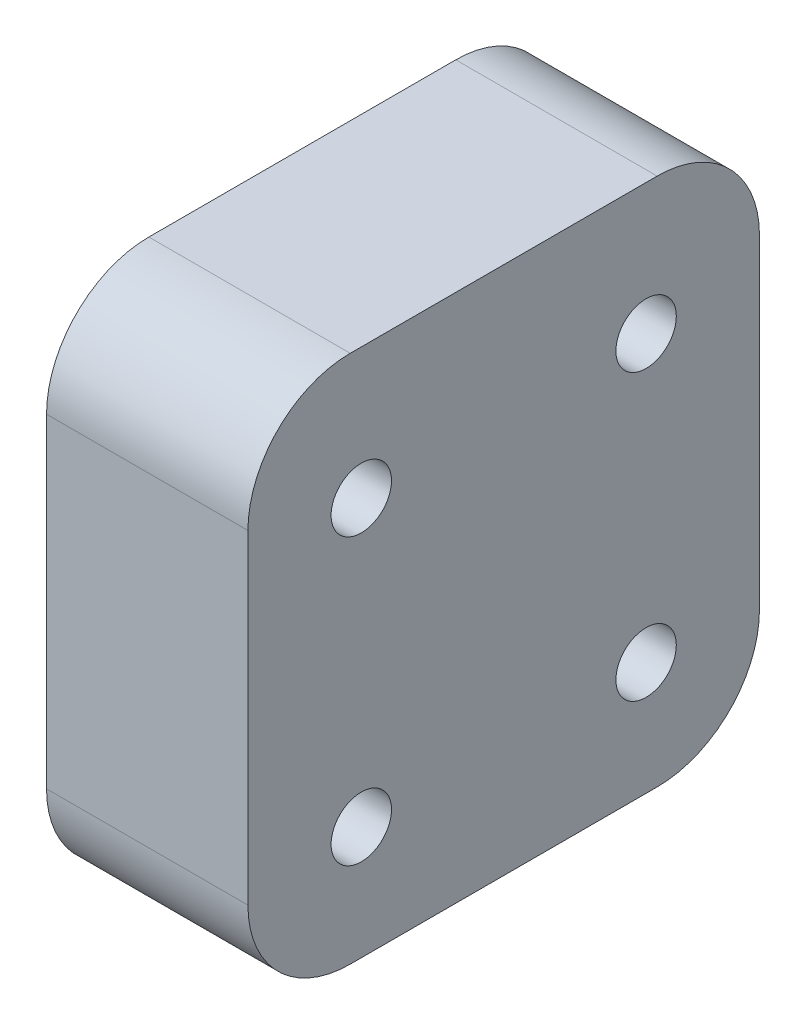
ISO-10303-21;
HEADER;
FILE_DESCRIPTION(('STEP AP214'),'2;1');
FILE_NAME('part.step','',(''),(''),'','','');
FILE_SCHEMA(('AUTOMOTIVE_DESIGN { 1 0 10303 214 1 1 1 1 }'));
ENDSEC;
DATA;
#1=APPLICATION_CONTEXT('core data for automotive mechanical design processes');
#2=APPLICATION_PROTOCOL_DEFINITION('international standard','automotive_design',2000,#1);
#3=PRODUCT_CONTEXT('',#1,'mechanical');
#4=PRODUCT('Part','Part','',(#3));
#5=PRODUCT_RELATED_PRODUCT_CATEGORY('part','',(#4));
#6=PRODUCT_DEFINITION_FORMATION('','',#4);
#7=PRODUCT_DEFINITION_CONTEXT('part definition',#1,'design');
#8=PRODUCT_DEFINITION('design','',#6,#7);
#9=PRODUCT_DEFINITION_SHAPE('','',#8);
#10=(LENGTH_UNIT() NAMED_UNIT(*) SI_UNIT(.MILLI.,.METRE.));
#11=(NAMED_UNIT(*) PLANE_ANGLE_UNIT() SI_UNIT($,.RADIAN.));
#12=(NAMED_UNIT(*) SI_UNIT($,.STERADIAN.) SOLID_ANGLE_UNIT());
#13=UNCERTAINTY_MEASURE_WITH_UNIT(LENGTH_MEASURE(1.E-05),#10,'distance_accuracy_value','');
#14=(GEOMETRIC_REPRESENTATION_CONTEXT(3) GLOBAL_UNCERTAINTY_ASSIGNED_CONTEXT((#13)) GLOBAL_UNIT_ASSIGNED_CONTEXT((#10,
#11,#12)) REPRESENTATION_CONTEXT('',''));
#15=CARTESIAN_POINT('',(0.,0.,0.));
#16=DIRECTION('',(0.,0.,1.));
#17=DIRECTION('',(1.,0.,0.));
#18=AXIS2_PLACEMENT_3D('',#15,#16,#17);
#19=CARTESIAN_POINT('',(-240.,0.231067933865589,-3.36106781186452));
#20=DIRECTION('',(1.,0.,0.));
#21=DIRECTION('',(0.,0.,-1.));
#22=AXIS2_PLACEMENT_3D('',#19,#20,#21);
#23=CYLINDRICAL_SURFACE('',#22,1.5);
#24=CARTESIAN_POINT('',(0.,0.231067933865589,-3.36106781186452));
#25=DIRECTION('',(-1.,0.,0.));
#26=DIRECTION('',(0.,0.,1.));
#27=AXIS2_PLACEMENT_3D('',#24,#25,#26);
#28=CIRCLE('',#27,1.5);
#29=CARTESIAN_POINT('',(0.,0.231067933865589,-1.86106781186452));
#30=VERTEX_POINT('',#29);
#31=EDGE_CURVE('E149',#30,#30,#28,.T.);
#32=ORIENTED_EDGE('',*,*,#31,.T.);
#33=EDGE_LOOP('',(#32));
#34=FACE_BOUND('',#33,.T.);
#35=CARTESIAN_POINT('',(3.65,0.231067933865589,-3.36106781186452));
#36=DIRECTION('',(1.,0.,0.));
#37=DIRECTION('',(0.,0.,-1.));
#38=AXIS2_PLACEMENT_3D('',#35,#36,#37);
#39=CIRCLE('',#38,1.5);
#40=CARTESIAN_POINT('',(3.64999999999999,1.49832890281329,-4.1635948435474));
#41=VERTEX_POINT('',#40);
#42=CARTESIAN_POINT('',(3.64999999999999,0.551671219185868,-4.82640515645171));
#43=VERTEX_POINT('',#42);
#44=EDGE_CURVE('E122',#41,#43,#39,.T.);
#45=ORIENTED_EDGE('',*,*,#44,.T.);
#46=CARTESIAN_POINT('',(3.64999999999999,0.231067933865589,-3.36106781186452));
#47=DIRECTION('',(1.,0.,0.));
#48=DIRECTION('',(0.,0.,-1.));
#49=AXIS2_PLACEMENT_3D('',#46,#47,#48);
#50=CIRCLE('',#49,1.5);
#51=EDGE_CURVE('E119',#43,#41,#50,.T.);
#52=ORIENTED_EDGE('',*,*,#51,.T.);
#53=EDGE_LOOP('',(#45,#52));
#54=FACE_BOUND('',#53,.T.);
#55=ADVANCED_FACE('F44',(#34,#54),#23,.F.);
#56=CARTESIAN_POINT('',(-240.,0.23106793386559,-13.3610678118645));
#57=DIRECTION('',(1.,0.,0.));
#58=DIRECTION('',(0.,0.,-1.));
#59=AXIS2_PLACEMENT_3D('',#56,#57,#58);
#60=CYLINDRICAL_SURFACE('',#59,1.5);
#61=CARTESIAN_POINT('',(0.,0.23106793386559,-13.3610678118645));
#62=DIRECTION('',(-1.,0.,0.));
#63=DIRECTION('',(0.,0.,1.));
#64=AXIS2_PLACEMENT_3D('',#61,#62,#63);
#65=CIRCLE('',#64,1.5);
#66=CARTESIAN_POINT('',(0.,0.23106793386559,-11.8610678118645));
#67=VERTEX_POINT('',#66);
#68=EDGE_CURVE('E155',#67,#67,#65,.T.);
#69=ORIENTED_EDGE('',*,*,#68,.T.);
#70=EDGE_LOOP('',(#69));
#71=FACE_BOUND('',#70,.T.);
#72=CARTESIAN_POINT('',(3.64999999999999,0.23106793386559,-13.3610678118645));
#73=DIRECTION('',(1.,0.,0.));
#74=DIRECTION('',(0.,0.,-1.));
#75=AXIS2_PLACEMENT_3D('',#72,#73,#74);
#76=CIRCLE('',#75,1.5);
#77=CARTESIAN_POINT('',(3.64999999999999,0.23106793386559,-14.8610678118645));
#78=VERTEX_POINT('',#77);
#79=EDGE_CURVE('E206',#78,#78,#76,.F.);
#80=ORIENTED_EDGE('',*,*,#79,.F.);
#81=EDGE_LOOP('',(#80));
#82=FACE_BOUND('',#81,.T.);
#83=ADVANCED_FACE('F279',(#71,#82),#60,.F.);
#84=CARTESIAN_POINT('',(-240.,17.5510679338656,-13.3610678118645));
#85=DIRECTION('',(1.,0.,0.));
#86=DIRECTION('',(0.,0.,-1.));
#87=AXIS2_PLACEMENT_3D('',#84,#85,#86);
#88=CYLINDRICAL_SURFACE('',#87,1.5);
#89=CARTESIAN_POINT('',(0.,17.5510679338656,-13.3610678118645));
#90=DIRECTION('',(-1.,0.,0.));
#91=DIRECTION('',(0.,0.,1.));
#92=AXIS2_PLACEMENT_3D('',#89,#90,#91);
#93=CIRCLE('',#92,1.5);
#94=CARTESIAN_POINT('',(0.,17.5510679338656,-11.8610678118645));
#95=VERTEX_POINT('',#94);
#96=EDGE_CURVE('E158',#95,#95,#93,.T.);
#97=ORIENTED_EDGE('',*,*,#96,.T.);
#98=EDGE_LOOP('',(#97));
#99=FACE_BOUND('',#98,.T.);
#100=CARTESIAN_POINT('',(3.64999999999999,17.5510679338656,-13.3610678118645));
#101=DIRECTION('',(1.,0.,0.));
#102=DIRECTION('',(0.,0.,-1.));
#103=AXIS2_PLACEMENT_3D('',#100,#101,#102);
#104=CIRCLE('',#103,1.5);
#105=CARTESIAN_POINT('',(3.64999999999999,17.5510679338656,-14.8610678118645));
#106=VERTEX_POINT('',#105);
#107=EDGE_CURVE('E203',#106,#106,#104,.F.);
#108=ORIENTED_EDGE('',*,*,#107,.F.);
#109=EDGE_LOOP('',(#108));
#110=FACE_BOUND('',#109,.T.);
#111=ADVANCED_FACE('F285',(#99,#110),#88,.F.);
#112=CARTESIAN_POINT('',(-240.,17.5510679338656,-3.36106781186452));
#113=DIRECTION('',(1.,0.,0.));
#114=DIRECTION('',(0.,0.,-1.));
#115=AXIS2_PLACEMENT_3D('',#112,#113,#114);
#116=CYLINDRICAL_SURFACE('',#115,1.5);
#117=CARTESIAN_POINT('',(0.,17.5510679338656,-3.36106781186452));
#118=DIRECTION('',(-1.,0.,0.));
#119=DIRECTION('',(0.,0.,1.));
#120=AXIS2_PLACEMENT_3D('',#117,#118,#119);
#121=CIRCLE('',#120,1.5);
#122=CARTESIAN_POINT('',(0.,17.5510679338656,-1.86106781186452));
#123=VERTEX_POINT('',#122);
#124=EDGE_CURVE('E152',#123,#123,#121,.T.);
#125=ORIENTED_EDGE('',*,*,#124,.T.);
#126=EDGE_LOOP('',(#125));
#127=FACE_BOUND('',#126,.T.);
#128=CARTESIAN_POINT('',(3.65,17.5510679338656,-3.36106781186452));
#129=DIRECTION('',(1.,0.,0.));
#130=DIRECTION('',(0.,0.,-1.));
#131=AXIS2_PLACEMENT_3D('',#128,#129,#130);
#132=CIRCLE('',#131,1.5);
#133=CARTESIAN_POINT('',(3.64999999999999,17.2279834362635,-4.82586008635575));
#134=VERTEX_POINT('',#133);
#135=CARTESIAN_POINT('',(3.64999999999999,16.2841523094666,-4.16413991364231));
#136=VERTEX_POINT('',#135);
#137=EDGE_CURVE('E145',#134,#136,#132,.T.);
#138=ORIENTED_EDGE('',*,*,#137,.T.);
#139=CARTESIAN_POINT('',(3.64999999999999,17.5510679338656,-3.36106781186452));
#140=DIRECTION('',(1.,0.,0.));
#141=DIRECTION('',(0.,0.,-1.));
#142=AXIS2_PLACEMENT_3D('',#139,#140,#141);
#143=CIRCLE('',#142,1.5);
#144=EDGE_CURVE('E125',#136,#134,#143,.T.);
#145=ORIENTED_EDGE('',*,*,#144,.T.);
#146=EDGE_LOOP('',(#138,#145));
#147=FACE_BOUND('',#146,.T.);
#148=ADVANCED_FACE('F290',(#127,#147),#116,.F.);
#149=CARTESIAN_POINT('',(0.,-3.81,-25.4));
#150=DIRECTION('',(-1.,0.,0.));
#151=DIRECTION('',(0.,0.,1.));
#152=AXIS2_PLACEMENT_3D('',#149,#150,#151);
#153=PLANE('',#152);
#154=ORIENTED_EDGE('',*,*,#124,.F.);
#155=EDGE_LOOP('',(#154));
#156=FACE_BOUND('',#155,.T.);
#157=ORIENTED_EDGE('',*,*,#96,.F.);
#158=EDGE_LOOP('',(#157));
#159=FACE_BOUND('',#158,.T.);
#160=ORIENTED_EDGE('',*,*,#68,.F.);
#161=EDGE_LOOP('',(#160));
#162=FACE_BOUND('',#161,.T.);
#163=ORIENTED_EDGE('',*,*,#31,.F.);
#164=EDGE_LOOP('',(#163));
#165=FACE_BOUND('',#164,.T.);
#166=DIRECTION('',(0.,1.,0.));
#167=VECTOR('',#166,1.);
#168=CARTESIAN_POINT('',(0.,-3.81,0.));
#169=LINE('',#168,#167);
#170=CARTESIAN_POINT('',(0.,1.27,0.));
#171=VERTEX_POINT('',#170);
#172=CARTESIAN_POINT('',(0.,17.38,0.));
#173=VERTEX_POINT('',#172);
#174=EDGE_CURVE('E191',#171,#173,#169,.T.);
#175=ORIENTED_EDGE('',*,*,#174,.T.);
#176=CARTESIAN_POINT('',(0.,17.38,-5.08));
#177=DIRECTION('',(-1.,0.,0.));
#178=DIRECTION('',(0.,0.,1.));
#179=AXIS2_PLACEMENT_3D('',#176,#177,#178);
#180=CIRCLE('',#179,5.08);
#181=CARTESIAN_POINT('',(0.,22.46,-5.08));
#182=VERTEX_POINT('',#181);
#183=EDGE_CURVE('E233',#173,#182,#180,.T.);
#184=ORIENTED_EDGE('',*,*,#183,.T.);
#185=DIRECTION('',(0.,0.,1.));
#186=VECTOR('',#185,1.);
#187=CARTESIAN_POINT('',(0.,22.46,-25.4));
#188=LINE('',#187,#186);
#189=CARTESIAN_POINT('',(0.,22.46,-20.32));
#190=VERTEX_POINT('',#189);
#191=EDGE_CURVE('E178',#190,#182,#188,.T.);
#192=ORIENTED_EDGE('',*,*,#191,.F.);
#193=CARTESIAN_POINT('',(0.,17.38,-20.32));
#194=DIRECTION('',(-1.,0.,0.));
#195=DIRECTION('',(0.,0.,1.));
#196=AXIS2_PLACEMENT_3D('',#193,#194,#195);
#197=CIRCLE('',#196,5.08);
#198=CARTESIAN_POINT('',(0.,17.38,-25.4));
#199=VERTEX_POINT('',#198);
#200=EDGE_CURVE('E231',#190,#199,#197,.T.);
#201=ORIENTED_EDGE('',*,*,#200,.T.);
#202=DIRECTION('',(0.,1.,0.));
#203=VECTOR('',#202,1.);
#204=CARTESIAN_POINT('',(0.,-3.81,-25.4));
#205=LINE('',#204,#203);
#206=CARTESIAN_POINT('',(0.,1.27,-25.4));
#207=VERTEX_POINT('',#206);
#208=EDGE_CURVE('E126',#207,#199,#205,.T.);
#209=ORIENTED_EDGE('',*,*,#208,.F.);
#210=CARTESIAN_POINT('',(0.,1.27,-20.32));
#211=DIRECTION('',(-1.,0.,0.));
#212=DIRECTION('',(0.,0.,1.));
#213=AXIS2_PLACEMENT_3D('',#210,#211,#212);
#214=CIRCLE('',#213,5.08);
#215=CARTESIAN_POINT('',(0.,-3.81,-20.32));
#216=VERTEX_POINT('',#215);
#217=EDGE_CURVE('E65',#207,#216,#214,.T.);
#218=ORIENTED_EDGE('',*,*,#217,.T.);
#219=DIRECTION('',(0.,0.,1.));
#220=VECTOR('',#219,1.);
#221=CARTESIAN_POINT('',(0.,-3.81,-25.4));
#222=LINE('',#221,#220);
#223=CARTESIAN_POINT('',(0.,-3.81,-5.08));
#224=VERTEX_POINT('',#223);
#225=EDGE_CURVE('E186',#216,#224,#222,.T.);
#226=ORIENTED_EDGE('',*,*,#225,.T.);
#227=CARTESIAN_POINT('',(0.,1.27,-5.08));
#228=DIRECTION('',(-1.,0.,0.));
#229=DIRECTION('',(0.,0.,1.));
#230=AXIS2_PLACEMENT_3D('',#227,#228,#229);
#231=CIRCLE('',#230,5.08);
#232=EDGE_CURVE('E228',#224,#171,#231,.T.);
#233=ORIENTED_EDGE('',*,*,#232,.T.);
#234=EDGE_LOOP('',(#175,#184,#192,#201,#209,#218,#226,#233));
#235=FACE_BOUND('',#234,.T.);
#236=ADVANCED_FACE('F256',(#156,#159,#162,#165,#235),#153,.T.);
#237=CARTESIAN_POINT('',(10.,-3.81,-25.4));
#238=DIRECTION('',(0.,0.,-1.));
#239=DIRECTION('',(-1.,0.,0.));
#240=AXIS2_PLACEMENT_3D('',#237,#238,#239);
#241=PLANE('',#240);
#242=ORIENTED_EDGE('',*,*,#208,.T.);
#243=DIRECTION('',(-1.,0.,0.));
#244=VECTOR('',#243,1.);
#245=CARTESIAN_POINT('',(10.,17.38,-25.4));
#246=LINE('',#245,#244);
#247=CARTESIAN_POINT('',(10.,17.38,-25.4));
#248=VERTEX_POINT('',#247);
#249=EDGE_CURVE('E238',#199,#248,#246,.F.);
#250=ORIENTED_EDGE('',*,*,#249,.T.);
#251=DIRECTION('',(0.,1.,0.));
#252=VECTOR('',#251,1.);
#253=CARTESIAN_POINT('',(10.,-3.81,-25.4));
#254=LINE('',#253,#252);
#255=CARTESIAN_POINT('',(10.,1.27,-25.4));
#256=VERTEX_POINT('',#255);
#257=EDGE_CURVE('E194',#256,#248,#254,.T.);
#258=ORIENTED_EDGE('',*,*,#257,.F.);
#259=DIRECTION('',(-1.,0.,0.));
#260=VECTOR('',#259,1.);
#261=CARTESIAN_POINT('',(0.,1.27,-25.4));
#262=LINE('',#261,#260);
#263=EDGE_CURVE('E235',#256,#207,#262,.T.);
#264=ORIENTED_EDGE('',*,*,#263,.T.);
#265=EDGE_LOOP('',(#242,#250,#258,#264));
#266=FACE_BOUND('',#265,.T.);
#267=ADVANCED_FACE('F242',(#266),#241,.T.);
#268=CARTESIAN_POINT('',(10.,-3.81,0.));
#269=DIRECTION('',(1.,0.,0.));
#270=DIRECTION('',(0.,0.,-1.));
#271=AXIS2_PLACEMENT_3D('',#268,#269,#270);
#272=PLANE('',#271);
#273=CARTESIAN_POINT('',(10.,15.9610678118645,-5.62893218813354));
#274=DIRECTION('',(1.,0.,0.));
#275=DIRECTION('',(0.,0.,-1.));
#276=AXIS2_PLACEMENT_3D('',#273,#274,#275);
#277=CIRCLE('',#276,1.5);
#278=CARTESIAN_POINT('',(10.,15.9610678118645,-7.12893218813354));
#279=VERTEX_POINT('',#278);
#280=EDGE_CURVE('E164',#279,#279,#277,.T.);
#281=ORIENTED_EDGE('',*,*,#280,.F.);
#282=EDGE_LOOP('',(#281));
#283=FACE_BOUND('',#282,.T.);
#284=CARTESIAN_POINT('',(10.,1.81893218813357,-5.62893218813459));
#285=DIRECTION('',(1.,0.,0.));
#286=DIRECTION('',(0.,0.,-1.));
#287=AXIS2_PLACEMENT_3D('',#284,#285,#286);
#288=CIRCLE('',#287,1.5);
#289=CARTESIAN_POINT('',(10.,1.81893218813357,-7.12893218813459));
#290=VERTEX_POINT('',#289);
#291=EDGE_CURVE('E134',#290,#290,#288,.T.);
#292=ORIENTED_EDGE('',*,*,#291,.F.);
#293=EDGE_LOOP('',(#292));
#294=FACE_BOUND('',#293,.T.);
#295=CARTESIAN_POINT('',(10.,1.81893218813461,-19.7710678118656));
#296=DIRECTION('',(1.,0.,0.));
#297=DIRECTION('',(0.,0.,-1.));
#298=AXIS2_PLACEMENT_3D('',#295,#296,#297);
#299=CIRCLE('',#298,1.5);
#300=CARTESIAN_POINT('',(10.,1.81893218813461,-21.2710678118656));
#301=VERTEX_POINT('',#300);
#302=EDGE_CURVE('E133',#301,#301,#299,.T.);
#303=ORIENTED_EDGE('',*,*,#302,.F.);
#304=EDGE_LOOP('',(#303));
#305=FACE_BOUND('',#304,.T.);
#306=CARTESIAN_POINT('',(10.,15.9610678118656,-19.7710678118645));
#307=DIRECTION('',(1.,0.,0.));
#308=DIRECTION('',(0.,0.,-1.));
#309=AXIS2_PLACEMENT_3D('',#306,#307,#308);
#310=CIRCLE('',#309,1.5);
#311=CARTESIAN_POINT('',(10.,15.9610678118656,-21.2710678118645));
#312=VERTEX_POINT('',#311);
#313=EDGE_CURVE('E165',#312,#312,#310,.T.);
#314=ORIENTED_EDGE('',*,*,#313,.F.);
#315=EDGE_LOOP('',(#314));
#316=FACE_BOUND('',#315,.T.);
#317=DIRECTION('',(0.,0.,-1.));
#318=VECTOR('',#317,1.);
#319=CARTESIAN_POINT('',(10.,22.46,0.));
#320=LINE('',#319,#318);
#321=CARTESIAN_POINT('',(10.,22.46,-5.08));
#322=VERTEX_POINT('',#321);
#323=CARTESIAN_POINT('',(10.,22.46,-20.32));
#324=VERTEX_POINT('',#323);
#325=EDGE_CURVE('E183',#322,#324,#320,.T.);
#326=ORIENTED_EDGE('',*,*,#325,.F.);
#327=CARTESIAN_POINT('',(10.,17.38,-5.08));
#328=DIRECTION('',(1.,0.,0.));
#329=DIRECTION('',(0.,0.,-1.));
#330=AXIS2_PLACEMENT_3D('',#327,#328,#329);
#331=CIRCLE('',#330,5.08);
#332=CARTESIAN_POINT('',(10.,17.38,0.));
#333=VERTEX_POINT('',#332);
#334=EDGE_CURVE('E221',#322,#333,#331,.T.);
#335=ORIENTED_EDGE('',*,*,#334,.T.);
#336=DIRECTION('',(0.,1.,0.));
#337=VECTOR('',#336,1.);
#338=CARTESIAN_POINT('',(10.,-3.81,0.));
#339=LINE('',#338,#337);
#340=CARTESIAN_POINT('',(10.,1.27,0.));
#341=VERTEX_POINT('',#340);
#342=EDGE_CURVE('E197',#341,#333,#339,.T.);
#343=ORIENTED_EDGE('',*,*,#342,.F.);
#344=CARTESIAN_POINT('',(10.,1.27,-5.08));
#345=DIRECTION('',(1.,0.,0.));
#346=DIRECTION('',(0.,0.,-1.));
#347=AXIS2_PLACEMENT_3D('',#344,#345,#346);
#348=CIRCLE('',#347,5.08);
#349=CARTESIAN_POINT('',(10.,-3.81,-5.08));
#350=VERTEX_POINT('',#349);
#351=EDGE_CURVE('E215',#341,#350,#348,.T.);
#352=ORIENTED_EDGE('',*,*,#351,.T.);
#353=DIRECTION('',(0.,0.,-1.));
#354=VECTOR('',#353,1.);
#355=CARTESIAN_POINT('',(10.,-3.81,0.));
#356=LINE('',#355,#354);
#357=CARTESIAN_POINT('',(10.,-3.81,-20.32));
#358=VERTEX_POINT('',#357);
#359=EDGE_CURVE('E188',#350,#358,#356,.T.);
#360=ORIENTED_EDGE('',*,*,#359,.T.);
#361=CARTESIAN_POINT('',(10.,1.27,-20.32));
#362=DIRECTION('',(1.,0.,0.));
#363=DIRECTION('',(0.,0.,-1.));
#364=AXIS2_PLACEMENT_3D('',#361,#362,#363);
#365=CIRCLE('',#364,5.08);
#366=EDGE_CURVE('E217',#358,#256,#365,.T.);
#367=ORIENTED_EDGE('',*,*,#366,.T.);
#368=ORIENTED_EDGE('',*,*,#257,.T.);
#369=CARTESIAN_POINT('',(10.,17.38,-20.32));
#370=DIRECTION('',(1.,0.,0.));
#371=DIRECTION('',(0.,0.,-1.));
#372=AXIS2_PLACEMENT_3D('',#369,#370,#371);
#373=CIRCLE('',#372,5.08);
#374=EDGE_CURVE('E219',#248,#324,#373,.T.);
#375=ORIENTED_EDGE('',*,*,#374,.T.);
#376=EDGE_LOOP('',(#326,#335,#343,#352,#360,#367,#368,#375));
#377=FACE_BOUND('',#376,.T.);
#378=ADVANCED_FACE('F248',(#283,#294,#305,#316,#377),#272,.T.);
#379=CARTESIAN_POINT('',(0.,-3.81,0.));
#380=DIRECTION('',(0.,0.,1.));
#381=DIRECTION('',(1.,0.,0.));
#382=AXIS2_PLACEMENT_3D('',#379,#380,#381);
#383=PLANE('',#382);
#384=ORIENTED_EDGE('',*,*,#342,.T.);
#385=DIRECTION('',(1.,0.,0.));
#386=VECTOR('',#385,1.);
#387=CARTESIAN_POINT('',(0.,17.38,0.));
#388=LINE('',#387,#386);
#389=EDGE_CURVE('E226',#333,#173,#388,.F.);
#390=ORIENTED_EDGE('',*,*,#389,.T.);
#391=ORIENTED_EDGE('',*,*,#174,.F.);
#392=DIRECTION('',(1.,0.,0.));
#393=VECTOR('',#392,1.);
#394=CARTESIAN_POINT('',(10.,1.27,0.));
#395=LINE('',#394,#393);
#396=EDGE_CURVE('E223',#171,#341,#395,.T.);
#397=ORIENTED_EDGE('',*,*,#396,.T.);
#398=EDGE_LOOP('',(#384,#390,#391,#397));
#399=FACE_BOUND('',#398,.T.);
#400=ADVANCED_FACE('F264',(#399),#383,.T.);
#401=CARTESIAN_POINT('',(0.,-3.81,0.));
#402=DIRECTION('',(0.,1.,0.));
#403=DIRECTION('',(0.,0.,1.));
#404=AXIS2_PLACEMENT_3D('',#401,#402,#403);
#405=PLANE('',#404);
#406=ORIENTED_EDGE('',*,*,#225,.F.);
#407=DIRECTION('',(-1.,0.,0.));
#408=VECTOR('',#407,1.);
#409=CARTESIAN_POINT('',(10.,-3.81,-20.32));
#410=LINE('',#409,#408);
#411=EDGE_CURVE('E12',#216,#358,#410,.F.);
#412=ORIENTED_EDGE('',*,*,#411,.T.);
#413=ORIENTED_EDGE('',*,*,#359,.F.);
#414=DIRECTION('',(1.,0.,0.));
#415=VECTOR('',#414,1.);
#416=CARTESIAN_POINT('',(0.,-3.81,-5.08));
#417=LINE('',#416,#415);
#418=EDGE_CURVE('E52',#350,#224,#417,.F.);
#419=ORIENTED_EDGE('',*,*,#418,.T.);
#420=EDGE_LOOP('',(#406,#412,#413,#419));
#421=FACE_BOUND('',#420,.T.);
#422=ADVANCED_FACE('F268',(#421),#405,.F.);
#423=CARTESIAN_POINT('',(0.,22.46,0.));
#424=DIRECTION('',(0.,1.,0.));
#425=DIRECTION('',(0.,0.,1.));
#426=AXIS2_PLACEMENT_3D('',#423,#424,#425);
#427=PLANE('',#426);
#428=ORIENTED_EDGE('',*,*,#191,.T.);
#429=DIRECTION('',(1.,0.,0.));
#430=VECTOR('',#429,1.);
#431=CARTESIAN_POINT('',(0.,22.46,-5.08));
#432=LINE('',#431,#430);
#433=EDGE_CURVE('E212',#182,#322,#432,.T.);
#434=ORIENTED_EDGE('',*,*,#433,.T.);
#435=ORIENTED_EDGE('',*,*,#325,.T.);
#436=DIRECTION('',(-1.,0.,0.));
#437=VECTOR('',#436,1.);
#438=CARTESIAN_POINT('',(0.,22.46,-20.32));
#439=LINE('',#438,#437);
#440=EDGE_CURVE('E209',#324,#190,#439,.T.);
#441=ORIENTED_EDGE('',*,*,#440,.T.);
#442=EDGE_LOOP('',(#428,#434,#435,#441));
#443=FACE_BOUND('',#442,.T.);
#444=ADVANCED_FACE('F254',(#443),#427,.T.);
#445=CARTESIAN_POINT('',(3.65,15.9610678118645,-5.62893218813354));
#446=DIRECTION('',(1.,0.,0.));
#447=DIRECTION('',(0.,0.,-1.));
#448=AXIS2_PLACEMENT_3D('',#445,#446,#447);
#449=CYLINDRICAL_SURFACE('',#448,1.5);
#450=CARTESIAN_POINT('',(3.65,15.9610678118645,-5.62893218813354));
#451=DIRECTION('',(1.,0.,0.));
#452=DIRECTION('',(0.,0.,-1.));
#453=AXIS2_PLACEMENT_3D('',#450,#451,#452);
#454=CIRCLE('',#453,1.5);
#455=EDGE_CURVE('E142',#136,#134,#454,.F.);
#456=ORIENTED_EDGE('',*,*,#455,.T.);
#457=CARTESIAN_POINT('',(3.65,15.9610678118645,-5.62893218813354));
#458=DIRECTION('',(1.,0.,0.));
#459=DIRECTION('',(0.,0.,-1.));
#460=AXIS2_PLACEMENT_3D('',#457,#458,#459);
#461=CIRCLE('',#460,1.5);
#462=EDGE_CURVE('E175',#136,#134,#461,.T.);
#463=ORIENTED_EDGE('',*,*,#462,.F.);
#464=EDGE_LOOP('',(#456,#463));
#465=FACE_BOUND('',#464,.T.);
#466=ORIENTED_EDGE('',*,*,#280,.T.);
#467=EDGE_LOOP('',(#466));
#468=FACE_BOUND('',#467,.T.);
#469=ADVANCED_FACE('F316',(#465,#468),#449,.F.);
#470=CARTESIAN_POINT('',(3.65,0.,0.));
#471=DIRECTION('',(1.,0.,0.));
#472=DIRECTION('',(0.,0.,-1.));
#473=AXIS2_PLACEMENT_3D('',#470,#471,#472);
#474=PLANE('',#473);
#475=ORIENTED_EDGE('',*,*,#144,.F.);
#476=ORIENTED_EDGE('',*,*,#462,.T.);
#477=EDGE_LOOP('',(#475,#476));
#478=FACE_BOUND('',#477,.T.);
#479=ADVANCED_FACE('F300',(#478),#474,.T.);
#480=CARTESIAN_POINT('',(3.65,15.9610678118656,-19.7710678118645));
#481=DIRECTION('',(1.,0.,0.));
#482=DIRECTION('',(0.,0.,-1.));
#483=AXIS2_PLACEMENT_3D('',#480,#481,#482);
#484=CYLINDRICAL_SURFACE('',#483,1.5);
#485=CARTESIAN_POINT('',(3.65,15.9610678118656,-19.7710678118645));
#486=DIRECTION('',(1.,0.,0.));
#487=DIRECTION('',(0.,0.,-1.));
#488=AXIS2_PLACEMENT_3D('',#485,#486,#487);
#489=CIRCLE('',#488,1.5);
#490=CARTESIAN_POINT('',(3.65,15.9610678118656,-21.2710678118645));
#491=VERTEX_POINT('',#490);
#492=EDGE_CURVE('E161',#491,#491,#489,.T.);
#493=ORIENTED_EDGE('',*,*,#492,.F.);
#494=EDGE_LOOP('',(#493));
#495=FACE_BOUND('',#494,.T.);
#496=ORIENTED_EDGE('',*,*,#313,.T.);
#497=EDGE_LOOP('',(#496));
#498=FACE_BOUND('',#497,.T.);
#499=ADVANCED_FACE('F296',(#495,#498),#484,.F.);
#500=CARTESIAN_POINT('',(3.65,0.,0.));
#501=DIRECTION('',(1.,0.,0.));
#502=DIRECTION('',(0.,0.,-1.));
#503=AXIS2_PLACEMENT_3D('',#500,#501,#502);
#504=PLANE('',#503);
#505=ORIENTED_EDGE('',*,*,#492,.T.);
#506=EDGE_LOOP('',(#505));
#507=FACE_BOUND('',#506,.T.);
#508=ADVANCED_FACE('F292',(#507),#504,.T.);
#509=CARTESIAN_POINT('',(3.65,1.81893218813461,-19.7710678118656));
#510=DIRECTION('',(1.,0.,0.));
#511=DIRECTION('',(0.,0.,-1.));
#512=AXIS2_PLACEMENT_3D('',#509,#510,#511);
#513=CYLINDRICAL_SURFACE('',#512,1.5);
#514=CARTESIAN_POINT('',(3.65,1.81893218813461,-19.7710678118656));
#515=DIRECTION('',(1.,0.,0.));
#516=DIRECTION('',(0.,0.,-1.));
#517=AXIS2_PLACEMENT_3D('',#514,#515,#516);
#518=CIRCLE('',#517,1.5);
#519=CARTESIAN_POINT('',(3.65,1.81893218813461,-21.2710678118656));
#520=VERTEX_POINT('',#519);
#521=EDGE_CURVE('E168',#520,#520,#518,.T.);
#522=ORIENTED_EDGE('',*,*,#521,.F.);
#523=EDGE_LOOP('',(#522));
#524=FACE_BOUND('',#523,.T.);
#525=ORIENTED_EDGE('',*,*,#302,.T.);
#526=EDGE_LOOP('',(#525));
#527=FACE_BOUND('',#526,.T.);
#528=ADVANCED_FACE('F295',(#524,#527),#513,.F.);
#529=CARTESIAN_POINT('',(3.65,0.,0.));
#530=DIRECTION('',(1.,0.,0.));
#531=DIRECTION('',(0.,0.,-1.));
#532=AXIS2_PLACEMENT_3D('',#529,#530,#531);
#533=PLANE('',#532);
#534=ORIENTED_EDGE('',*,*,#521,.T.);
#535=EDGE_LOOP('',(#534));
#536=FACE_BOUND('',#535,.T.);
#537=ADVANCED_FACE('F302',(#536),#533,.T.);
#538=CARTESIAN_POINT('',(3.65,1.81893218813357,-5.62893218813459));
#539=DIRECTION('',(1.,0.,0.));
#540=DIRECTION('',(0.,0.,-1.));
#541=AXIS2_PLACEMENT_3D('',#538,#539,#540);
#542=CYLINDRICAL_SURFACE('',#541,1.5);
#543=CARTESIAN_POINT('',(3.65,1.81893218813357,-5.62893218813459));
#544=DIRECTION('',(1.,0.,0.));
#545=DIRECTION('',(0.,0.,-1.));
#546=AXIS2_PLACEMENT_3D('',#543,#544,#545);
#547=CIRCLE('',#546,1.5);
#548=EDGE_CURVE('E136',#43,#41,#547,.F.);
#549=ORIENTED_EDGE('',*,*,#548,.T.);
#550=CARTESIAN_POINT('',(3.65,1.81893218813357,-5.62893218813459));
#551=DIRECTION('',(1.,0.,0.));
#552=DIRECTION('',(0.,0.,-1.));
#553=AXIS2_PLACEMENT_3D('',#550,#551,#552);
#554=CIRCLE('',#553,1.5);
#555=EDGE_CURVE('E128',#43,#41,#554,.T.);
#556=ORIENTED_EDGE('',*,*,#555,.F.);
#557=EDGE_LOOP('',(#549,#556));
#558=FACE_BOUND('',#557,.T.);
#559=ORIENTED_EDGE('',*,*,#291,.T.);
#560=EDGE_LOOP('',(#559));
#561=FACE_BOUND('',#560,.T.);
#562=ADVANCED_FACE('F137',(#558,#561),#542,.F.);
#563=CARTESIAN_POINT('',(3.65,0.,0.));
#564=DIRECTION('',(1.,0.,0.));
#565=DIRECTION('',(0.,0.,-1.));
#566=AXIS2_PLACEMENT_3D('',#563,#564,#565);
#567=PLANE('',#566);
#568=ORIENTED_EDGE('',*,*,#51,.F.);
#569=ORIENTED_EDGE('',*,*,#555,.T.);
#570=EDGE_LOOP('',(#568,#569));
#571=FACE_BOUND('',#570,.T.);
#572=ADVANCED_FACE('F130',(#571),#567,.T.);
#573=CARTESIAN_POINT('',(3.65,0.,0.));
#574=DIRECTION('',(1.,0.,0.));
#575=DIRECTION('',(0.,0.,-1.));
#576=AXIS2_PLACEMENT_3D('',#573,#574,#575);
#577=PLANE('',#576);
#578=ORIENTED_EDGE('',*,*,#455,.F.);
#579=ORIENTED_EDGE('',*,*,#137,.F.);
#580=EDGE_LOOP('',(#578,#579));
#581=FACE_BOUND('',#580,.T.);
#582=ADVANCED_FACE('F311',(#581),#577,.F.);
#583=CARTESIAN_POINT('',(3.65,0.,0.));
#584=DIRECTION('',(1.,0.,0.));
#585=DIRECTION('',(0.,0.,-1.));
#586=AXIS2_PLACEMENT_3D('',#583,#584,#585);
#587=PLANE('',#586);
#588=ORIENTED_EDGE('',*,*,#107,.T.);
#589=EDGE_LOOP('',(#588));
#590=FACE_BOUND('',#589,.T.);
#591=ADVANCED_FACE('F344',(#590),#587,.F.);
#592=CARTESIAN_POINT('',(3.65,0.,0.));
#593=DIRECTION('',(1.,0.,0.));
#594=DIRECTION('',(0.,0.,-1.));
#595=AXIS2_PLACEMENT_3D('',#592,#593,#594);
#596=PLANE('',#595);
#597=ORIENTED_EDGE('',*,*,#79,.T.);
#598=EDGE_LOOP('',(#597));
#599=FACE_BOUND('',#598,.T.);
#600=ADVANCED_FACE('F339',(#599),#596,.F.);
#601=CARTESIAN_POINT('',(3.65,0.,0.));
#602=DIRECTION('',(1.,0.,0.));
#603=DIRECTION('',(0.,0.,-1.));
#604=AXIS2_PLACEMENT_3D('',#601,#602,#603);
#605=PLANE('',#604);
#606=ORIENTED_EDGE('',*,*,#548,.F.);
#607=ORIENTED_EDGE('',*,*,#44,.F.);
#608=EDGE_LOOP('',(#606,#607));
#609=FACE_BOUND('',#608,.T.);
#610=ADVANCED_FACE('F141',(#609),#605,.F.);
#611=CARTESIAN_POINT('',(0.,17.38,-5.08));
#612=DIRECTION('',(1.,0.,0.));
#613=DIRECTION('',(0.,0.,-1.));
#614=AXIS2_PLACEMENT_3D('',#611,#612,#613);
#615=CYLINDRICAL_SURFACE('',#614,5.08);
#616=ORIENTED_EDGE('',*,*,#183,.F.);
#617=ORIENTED_EDGE('',*,*,#389,.F.);
#618=ORIENTED_EDGE('',*,*,#334,.F.);
#619=ORIENTED_EDGE('',*,*,#433,.F.);
#620=EDGE_LOOP('',(#616,#617,#618,#619));
#621=FACE_BOUND('',#620,.T.);
#622=ADVANCED_FACE('F261',(#621),#615,.T.);
#623=CARTESIAN_POINT('',(0.,17.38,-20.32));
#624=DIRECTION('',(-1.,0.,0.));
#625=DIRECTION('',(0.,0.,1.));
#626=AXIS2_PLACEMENT_3D('',#623,#624,#625);
#627=CYLINDRICAL_SURFACE('',#626,5.08);
#628=ORIENTED_EDGE('',*,*,#374,.F.);
#629=ORIENTED_EDGE('',*,*,#249,.F.);
#630=ORIENTED_EDGE('',*,*,#200,.F.);
#631=ORIENTED_EDGE('',*,*,#440,.F.);
#632=EDGE_LOOP('',(#628,#629,#630,#631));
#633=FACE_BOUND('',#632,.T.);
#634=ADVANCED_FACE('F251',(#633),#627,.T.);
#635=CARTESIAN_POINT('',(10.,1.27,-20.32));
#636=DIRECTION('',(1.,0.,0.));
#637=DIRECTION('',(0.,0.,-1.));
#638=AXIS2_PLACEMENT_3D('',#635,#636,#637);
#639=CYLINDRICAL_SURFACE('',#638,5.08);
#640=ORIENTED_EDGE('',*,*,#366,.F.);
#641=ORIENTED_EDGE('',*,*,#411,.F.);
#642=ORIENTED_EDGE('',*,*,#217,.F.);
#643=ORIENTED_EDGE('',*,*,#263,.F.);
#644=EDGE_LOOP('',(#640,#641,#642,#643));
#645=FACE_BOUND('',#644,.T.);
#646=ADVANCED_FACE('F271',(#645),#639,.T.);
#647=CARTESIAN_POINT('',(0.,1.27,-5.08));
#648=DIRECTION('',(-1.,0.,0.));
#649=DIRECTION('',(0.,0.,1.));
#650=AXIS2_PLACEMENT_3D('',#647,#648,#649);
#651=CYLINDRICAL_SURFACE('',#650,5.08);
#652=ORIENTED_EDGE('',*,*,#232,.F.);
#653=ORIENTED_EDGE('',*,*,#418,.F.);
#654=ORIENTED_EDGE('',*,*,#351,.F.);
#655=ORIENTED_EDGE('',*,*,#396,.F.);
#656=EDGE_LOOP('',(#652,#653,#654,#655));
#657=FACE_BOUND('',#656,.T.);
#658=ADVANCED_FACE('F46',(#657),#651,.T.);
#659=CLOSED_SHELL('',(#55,#83,#111,#148,#236,#267,#378,#400,#422,#444,#469,#479,#499,#508,#528,
#537,#562,#572,#582,#591,#600,#610,#622,#634,#646,#658));
#660=MANIFOLD_SOLID_BREP('B2',#659);
#661=ADVANCED_BREP_SHAPE_REPRESENTATION('',(#18,#660),#14);
#662=SHAPE_DEFINITION_REPRESENTATION(#9,#661);
ENDSEC;
END-ISO-10303-21;
